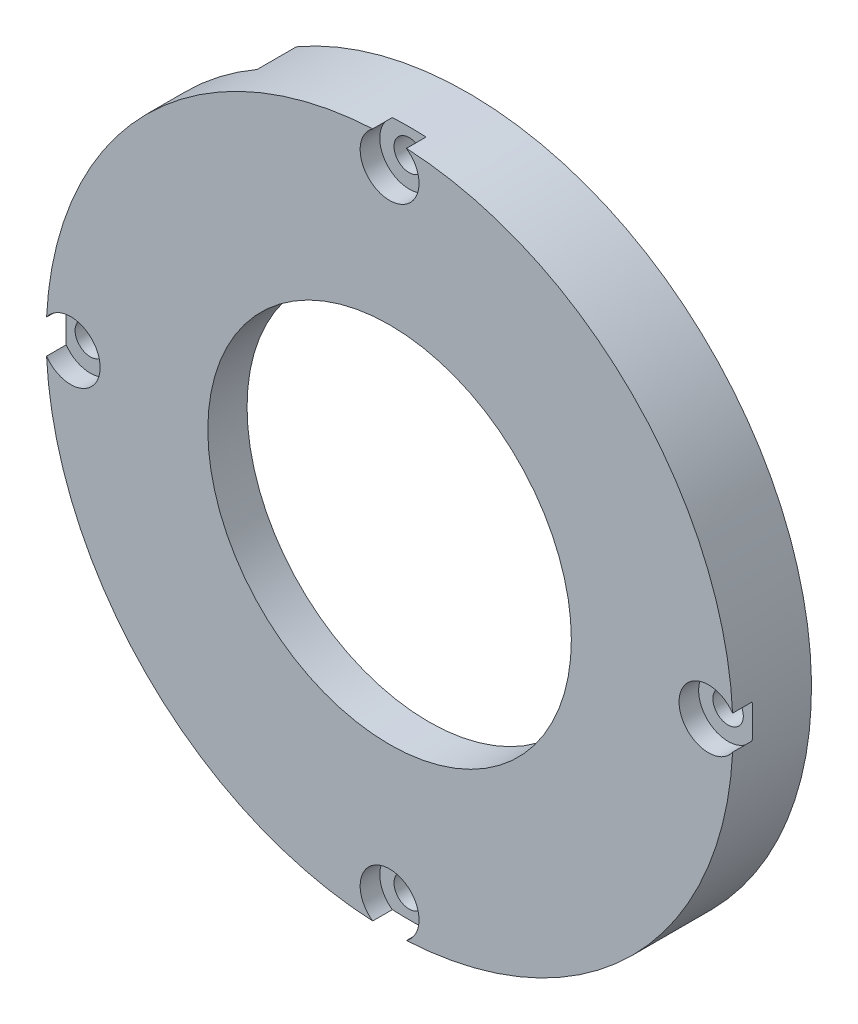
ISO-10303-21;
HEADER;
FILE_DESCRIPTION(('STEP AP214'),'2;1');
FILE_NAME('part.step','',(''),(''),'','','');
FILE_SCHEMA(('AUTOMOTIVE_DESIGN { 1 0 10303 214 1 1 1 1 }'));
ENDSEC;
DATA;
#1=APPLICATION_CONTEXT('core data for automotive mechanical design processes');
#2=APPLICATION_PROTOCOL_DEFINITION('international standard','automotive_design',2000,#1);
#3=PRODUCT_CONTEXT('',#1,'mechanical');
#4=PRODUCT('Part','Part','',(#3));
#5=PRODUCT_RELATED_PRODUCT_CATEGORY('part','',(#4));
#6=PRODUCT_DEFINITION_FORMATION('','',#4);
#7=PRODUCT_DEFINITION_CONTEXT('part definition',#1,'design');
#8=PRODUCT_DEFINITION('design','',#6,#7);
#9=PRODUCT_DEFINITION_SHAPE('','',#8);
#10=(LENGTH_UNIT() NAMED_UNIT(*) SI_UNIT(.MILLI.,.METRE.));
#11=(NAMED_UNIT(*) PLANE_ANGLE_UNIT() SI_UNIT($,.RADIAN.));
#12=(NAMED_UNIT(*) SI_UNIT($,.STERADIAN.) SOLID_ANGLE_UNIT());
#13=UNCERTAINTY_MEASURE_WITH_UNIT(LENGTH_MEASURE(1.E-05),#10,'distance_accuracy_value','');
#14=(GEOMETRIC_REPRESENTATION_CONTEXT(3) GLOBAL_UNCERTAINTY_ASSIGNED_CONTEXT((#13)) GLOBAL_UNIT_ASSIGNED_CONTEXT((#10,
#11,#12)) REPRESENTATION_CONTEXT('',''));
#15=CARTESIAN_POINT('',(0.,0.,0.));
#16=DIRECTION('',(0.,0.,1.));
#17=DIRECTION('',(1.,0.,0.));
#18=AXIS2_PLACEMENT_3D('',#15,#16,#17);
#19=CARTESIAN_POINT('',(0.,32.5,10.));
#20=DIRECTION('',(0.,0.,-1.));
#21=DIRECTION('',(-1.,0.,0.));
#22=AXIS2_PLACEMENT_3D('',#19,#20,#21);
#23=CYLINDRICAL_SURFACE('',#22,1.55);
#24=CARTESIAN_POINT('',(0.,32.5,2.));
#25=DIRECTION('',(0.,0.,-1.));
#26=DIRECTION('',(-1.,0.,0.));
#27=AXIS2_PLACEMENT_3D('',#24,#25,#26);
#28=CIRCLE('',#27,1.55);
#29=CARTESIAN_POINT('',(-1.55,32.5,2.));
#30=VERTEX_POINT('',#29);
#31=EDGE_CURVE('E184',#30,#30,#28,.T.);
#32=ORIENTED_EDGE('',*,*,#31,.T.);
#33=EDGE_LOOP('',(#32));
#34=FACE_BOUND('',#33,.T.);
#35=CARTESIAN_POINT('',(0.,32.5,8.));
#36=DIRECTION('',(0.,0.,1.));
#37=DIRECTION('',(1.,0.,0.));
#38=AXIS2_PLACEMENT_3D('',#35,#36,#37);
#39=CIRCLE('',#38,1.55);
#40=CARTESIAN_POINT('',(1.55,32.5,8.));
#41=VERTEX_POINT('',#40);
#42=EDGE_CURVE('E46',#41,#41,#39,.T.);
#43=ORIENTED_EDGE('',*,*,#42,.T.);
#44=EDGE_LOOP('',(#43));
#45=FACE_BOUND('',#44,.T.);
#46=ADVANCED_FACE('F42',(#34,#45),#23,.F.);
#47=CARTESIAN_POINT('',(32.5000000000009,9.17735403342287E-13,10.));
#48=DIRECTION('',(0.,0.,-1.));
#49=DIRECTION('',(-1.,0.,0.));
#50=AXIS2_PLACEMENT_3D('',#47,#48,#49);
#51=CYLINDRICAL_SURFACE('',#50,1.55000000000072);
#52=CARTESIAN_POINT('',(32.5000000000009,9.17735403342287E-13,2.));
#53=DIRECTION('',(0.,0.,-1.));
#54=DIRECTION('',(-1.,0.,0.));
#55=AXIS2_PLACEMENT_3D('',#52,#53,#54);
#56=CIRCLE('',#55,1.55000000000072);
#57=CARTESIAN_POINT('',(30.9500000000002,9.17735403342287E-13,2.));
#58=VERTEX_POINT('',#57);
#59=EDGE_CURVE('E181',#58,#58,#56,.T.);
#60=ORIENTED_EDGE('',*,*,#59,.T.);
#61=EDGE_LOOP('',(#60));
#62=FACE_BOUND('',#61,.T.);
#63=CARTESIAN_POINT('',(32.5000000000009,9.17735403342287E-13,8.));
#64=DIRECTION('',(0.,0.,1.));
#65=DIRECTION('',(1.,0.,0.));
#66=AXIS2_PLACEMENT_3D('',#63,#64,#65);
#67=CIRCLE('',#66,1.55000000000072);
#68=CARTESIAN_POINT('',(34.0500000000016,9.17735403342287E-13,8.));
#69=VERTEX_POINT('',#68);
#70=EDGE_CURVE('E163',#69,#69,#67,.T.);
#71=ORIENTED_EDGE('',*,*,#70,.T.);
#72=EDGE_LOOP('',(#71));
#73=FACE_BOUND('',#72,.T.);
#74=ADVANCED_FACE('F226',(#62,#73),#51,.F.);
#75=CARTESIAN_POINT('',(1.83547080668457E-12,-32.5,10.));
#76=DIRECTION('',(0.,0.,-1.));
#77=DIRECTION('',(-1.,0.,0.));
#78=AXIS2_PLACEMENT_3D('',#75,#76,#77);
#79=CYLINDRICAL_SURFACE('',#78,1.55000000000197);
#80=CARTESIAN_POINT('',(1.83547080668457E-12,-32.5,2.));
#81=DIRECTION('',(0.,0.,-1.));
#82=DIRECTION('',(-1.,0.,0.));
#83=AXIS2_PLACEMENT_3D('',#80,#81,#82);
#84=CIRCLE('',#83,1.55000000000197);
#85=CARTESIAN_POINT('',(-1.55000000000014,-32.5,2.));
#86=VERTEX_POINT('',#85);
#87=EDGE_CURVE('E178',#86,#86,#84,.T.);
#88=ORIENTED_EDGE('',*,*,#87,.T.);
#89=EDGE_LOOP('',(#88));
#90=FACE_BOUND('',#89,.T.);
#91=CARTESIAN_POINT('',(1.83547080668457E-12,-32.5,8.));
#92=DIRECTION('',(0.,0.,1.));
#93=DIRECTION('',(1.,0.,0.));
#94=AXIS2_PLACEMENT_3D('',#91,#92,#93);
#95=CIRCLE('',#94,1.55000000000197);
#96=CARTESIAN_POINT('',(1.55000000000381,-32.5,8.));
#97=VERTEX_POINT('',#96);
#98=EDGE_CURVE('E150',#97,#97,#95,.T.);
#99=ORIENTED_EDGE('',*,*,#98,.T.);
#100=EDGE_LOOP('',(#99));
#101=FACE_BOUND('',#100,.T.);
#102=ADVANCED_FACE('F293',(#90,#101),#79,.F.);
#103=CARTESIAN_POINT('',(-32.4999999999991,-9.21715505439516E-13,10.));
#104=DIRECTION('',(0.,0.,-1.));
#105=DIRECTION('',(-1.,0.,0.));
#106=AXIS2_PLACEMENT_3D('',#103,#104,#105);
#107=CYLINDRICAL_SURFACE('',#106,1.55000000000148);
#108=CARTESIAN_POINT('',(-32.4999999999991,-9.21715505439516E-13,2.));
#109=DIRECTION('',(0.,0.,-1.));
#110=DIRECTION('',(-1.,0.,0.));
#111=AXIS2_PLACEMENT_3D('',#108,#109,#110);
#112=CIRCLE('',#111,1.55000000000148);
#113=CARTESIAN_POINT('',(-34.0500000000006,-9.21715505439516E-13,2.));
#114=VERTEX_POINT('',#113);
#115=EDGE_CURVE('E175',#114,#114,#112,.T.);
#116=ORIENTED_EDGE('',*,*,#115,.T.);
#117=EDGE_LOOP('',(#116));
#118=FACE_BOUND('',#117,.T.);
#119=CARTESIAN_POINT('',(-32.4999999999991,-9.21715505439516E-13,8.));
#120=DIRECTION('',(0.,0.,1.));
#121=DIRECTION('',(1.,0.,0.));
#122=AXIS2_PLACEMENT_3D('',#119,#120,#121);
#123=CIRCLE('',#122,1.55000000000148);
#124=CARTESIAN_POINT('',(-30.9499999999976,-9.21715505439516E-13,8.));
#125=VERTEX_POINT('',#124);
#126=EDGE_CURVE('E151',#125,#125,#123,.T.);
#127=ORIENTED_EDGE('',*,*,#126,.T.);
#128=EDGE_LOOP('',(#127));
#129=FACE_BOUND('',#128,.T.);
#130=ADVANCED_FACE('F301',(#118,#129),#107,.F.);
#131=CARTESIAN_POINT('',(0.,0.,10.));
#132=DIRECTION('',(0.,0.,-1.));
#133=DIRECTION('',(-1.,0.,0.));
#134=AXIS2_PLACEMENT_3D('',#131,#132,#133);
#135=CYLINDRICAL_SURFACE('',#134,30.05);
#136=DIRECTION('',(0.,0.,-1.));
#137=VECTOR('',#136,1.);
#138=CARTESIAN_POINT('',(-15.025,26.0240633837224,6.));
#139=LINE('',#138,#137);
#140=CARTESIAN_POINT('',(-15.025,26.0240633837224,6.));
#141=VERTEX_POINT('',#140);
#142=CARTESIAN_POINT('',(-15.025,26.0240633837224,2.));
#143=VERTEX_POINT('',#142);
#144=EDGE_CURVE('E195',#141,#143,#139,.T.);
#145=ORIENTED_EDGE('',*,*,#144,.T.);
#146=CARTESIAN_POINT('',(0.,0.,2.));
#147=DIRECTION('',(0.,0.,-1.));
#148=DIRECTION('',(-1.,0.,0.));
#149=AXIS2_PLACEMENT_3D('',#146,#147,#148);
#150=CIRCLE('',#149,30.05);
#151=CARTESIAN_POINT('',(-26.0240633837224,15.0249999999999,2.));
#152=VERTEX_POINT('',#151);
#153=EDGE_CURVE('E168',#143,#152,#150,.T.);
#154=ORIENTED_EDGE('',*,*,#153,.T.);
#155=DIRECTION('',(0.,0.,-1.));
#156=VECTOR('',#155,1.);
#157=CARTESIAN_POINT('',(-26.0240633837224,15.0249999999999,6.));
#158=LINE('',#157,#156);
#159=CARTESIAN_POINT('',(-26.0240633837224,15.0249999999999,6.));
#160=VERTEX_POINT('',#159);
#161=EDGE_CURVE('E194',#160,#152,#158,.T.);
#162=ORIENTED_EDGE('',*,*,#161,.F.);
#163=CARTESIAN_POINT('',(0.,0.,6.));
#164=DIRECTION('',(0.,0.,1.));
#165=DIRECTION('',(1.,0.,0.));
#166=AXIS2_PLACEMENT_3D('',#163,#164,#165);
#167=CIRCLE('',#166,30.05);
#168=EDGE_CURVE('E210',#160,#141,#167,.T.);
#169=ORIENTED_EDGE('',*,*,#168,.T.);
#170=EDGE_LOOP('',(#145,#154,#162,#169));
#171=FACE_BOUND('',#170,.T.);
#172=ADVANCED_FACE('F299',(#171),#135,.F.);
#173=CARTESIAN_POINT('',(0.,0.,10.));
#174=DIRECTION('',(0.,0.,-1.));
#175=DIRECTION('',(-1.,0.,0.));
#176=AXIS2_PLACEMENT_3D('',#173,#174,#175);
#177=CYLINDRICAL_SURFACE('',#176,35.);
#178=CARTESIAN_POINT('',(0.,0.,8.));
#179=DIRECTION('',(0.,0.,1.));
#180=DIRECTION('',(1.,0.,0.));
#181=AXIS2_PLACEMENT_3D('',#178,#179,#180);
#182=CIRCLE('',#181,35.);
#183=CARTESIAN_POINT('',(1.72039196717202,34.9576923076923,8.));
#184=VERTEX_POINT('',#183);
#185=CARTESIAN_POINT('',(-1.72039196717202,34.9576923076923,8.));
#186=VERTEX_POINT('',#185);
#187=EDGE_CURVE('E166',#184,#186,#182,.T.);
#188=ORIENTED_EDGE('',*,*,#187,.F.);
#189=DIRECTION('',(0.,0.,1.));
#190=VECTOR('',#189,1.);
#191=CARTESIAN_POINT('',(1.72039196717204,34.9576923076923,9.));
#192=LINE('',#191,#190);
#193=CARTESIAN_POINT('',(1.72039196717204,34.9576923076923,10.));
#194=VERTEX_POINT('',#193);
#195=EDGE_CURVE('E157',#184,#194,#192,.T.);
#196=ORIENTED_EDGE('',*,*,#195,.T.);
#197=CARTESIAN_POINT('',(0.,0.,10.));
#198=DIRECTION('',(0.,0.,1.));
#199=DIRECTION('',(1.,0.,0.));
#200=AXIS2_PLACEMENT_3D('',#197,#198,#199);
#201=CIRCLE('',#200,35.);
#202=CARTESIAN_POINT('',(34.9576923076921,1.72039196717575,10.));
#203=VERTEX_POINT('',#202);
#204=EDGE_CURVE('E216',#203,#194,#201,.T.);
#205=ORIENTED_EDGE('',*,*,#204,.F.);
#206=DIRECTION('',(0.,0.,1.));
#207=VECTOR('',#206,1.);
#208=CARTESIAN_POINT('',(34.9576923076921,1.72039196717575,9.));
#209=LINE('',#208,#207);
#210=CARTESIAN_POINT('',(34.9576923076921,1.72039196717577,8.));
#211=VERTEX_POINT('',#210);
#212=EDGE_CURVE('E241',#203,#211,#209,.F.);
#213=ORIENTED_EDGE('',*,*,#212,.T.);
#214=CARTESIAN_POINT('',(0.,0.,8.));
#215=DIRECTION('',(0.,0.,1.));
#216=DIRECTION('',(1.,0.,0.));
#217=AXIS2_PLACEMENT_3D('',#214,#215,#216);
#218=CIRCLE('',#217,35.);
#219=CARTESIAN_POINT('',(34.9576923076922,-1.72039196717379,8.));
#220=VERTEX_POINT('',#219);
#221=EDGE_CURVE('E164',#220,#211,#218,.T.);
#222=ORIENTED_EDGE('',*,*,#221,.F.);
#223=DIRECTION('',(0.,0.,1.));
#224=VECTOR('',#223,1.);
#225=CARTESIAN_POINT('',(34.9576923076922,-1.72039196717378,9.));
#226=LINE('',#225,#224);
#227=CARTESIAN_POINT('',(34.9576923076922,-1.72039196717378,10.));
#228=VERTEX_POINT('',#227);
#229=EDGE_CURVE('E243',#220,#228,#226,.T.);
#230=ORIENTED_EDGE('',*,*,#229,.T.);
#231=CARTESIAN_POINT('',(1.72039196717768,-34.957692307692,10.));
#232=VERTEX_POINT('',#231);
#233=EDGE_CURVE('E215',#232,#228,#201,.T.);
#234=ORIENTED_EDGE('',*,*,#233,.F.);
#235=DIRECTION('',(0.,0.,1.));
#236=VECTOR('',#235,1.);
#237=CARTESIAN_POINT('',(1.72039196717768,-34.957692307692,9.));
#238=LINE('',#237,#236);
#239=CARTESIAN_POINT('',(1.7203919671777,-34.957692307692,8.));
#240=VERTEX_POINT('',#239);
#241=EDGE_CURVE('E59',#232,#240,#238,.F.);
#242=ORIENTED_EDGE('',*,*,#241,.T.);
#243=CARTESIAN_POINT('',(0.,0.,8.));
#244=DIRECTION('',(0.,0.,1.));
#245=DIRECTION('',(1.,0.,0.));
#246=AXIS2_PLACEMENT_3D('',#243,#244,#245);
#247=CIRCLE('',#246,35.);
#248=CARTESIAN_POINT('',(-1.72039196717375,-34.9576923076922,8.));
#249=VERTEX_POINT('',#248);
#250=EDGE_CURVE('E154',#249,#240,#247,.T.);
#251=ORIENTED_EDGE('',*,*,#250,.F.);
#252=DIRECTION('',(0.,0.,1.));
#253=VECTOR('',#252,1.);
#254=CARTESIAN_POINT('',(-1.72039196717374,-34.9576923076922,9.));
#255=LINE('',#254,#253);
#256=CARTESIAN_POINT('',(-1.72039196717374,-34.9576923076922,10.));
#257=VERTEX_POINT('',#256);
#258=EDGE_CURVE('E249',#249,#257,#255,.T.);
#259=ORIENTED_EDGE('',*,*,#258,.T.);
#260=CARTESIAN_POINT('',(-34.9576923076922,-1.7203919671743,10.));
#261=VERTEX_POINT('',#260);
#262=EDGE_CURVE('E272',#261,#257,#201,.T.);
#263=ORIENTED_EDGE('',*,*,#262,.F.);
#264=DIRECTION('',(0.,0.,1.));
#265=VECTOR('',#264,1.);
#266=CARTESIAN_POINT('',(-34.9576923076922,-1.72039196717432,9.));
#267=LINE('',#266,#265);
#268=CARTESIAN_POINT('',(-34.9576923076922,-1.72039196717437,8.));
#269=VERTEX_POINT('',#268);
#270=EDGE_CURVE('E67',#261,#269,#267,.F.);
#271=ORIENTED_EDGE('',*,*,#270,.T.);
#272=CARTESIAN_POINT('',(0.,0.,8.));
#273=DIRECTION('',(0.,0.,1.));
#274=DIRECTION('',(1.,0.,0.));
#275=AXIS2_PLACEMENT_3D('',#272,#273,#274);
#276=CIRCLE('',#275,35.);
#277=CARTESIAN_POINT('',(-34.9576923076923,1.72039196717239,8.));
#278=VERTEX_POINT('',#277);
#279=EDGE_CURVE('E144',#278,#269,#276,.T.);
#280=ORIENTED_EDGE('',*,*,#279,.F.);
#281=DIRECTION('',(0.,0.,1.));
#282=VECTOR('',#281,1.);
#283=CARTESIAN_POINT('',(-34.9576923076923,1.72039196717234,9.));
#284=LINE('',#283,#282);
#285=CARTESIAN_POINT('',(-34.9576923076923,1.72039196717234,10.));
#286=VERTEX_POINT('',#285);
#287=EDGE_CURVE('E132',#278,#286,#284,.T.);
#288=ORIENTED_EDGE('',*,*,#287,.T.);
#289=CARTESIAN_POINT('',(-1.72039196717205,34.9576923076923,10.));
#290=VERTEX_POINT('',#289);
#291=EDGE_CURVE('E220',#290,#286,#201,.T.);
#292=ORIENTED_EDGE('',*,*,#291,.F.);
#293=DIRECTION('',(0.,0.,1.));
#294=VECTOR('',#293,1.);
#295=CARTESIAN_POINT('',(-1.72039196717204,34.9576923076923,9.));
#296=LINE('',#295,#294);
#297=EDGE_CURVE('E251',#290,#186,#296,.F.);
#298=ORIENTED_EDGE('',*,*,#297,.T.);
#299=EDGE_LOOP('',(#188,#196,#205,#213,#222,#230,#234,#242,#251,#259,#263,#271,#280,#288,#292,#298));
#300=FACE_BOUND('',#299,.T.);
#301=CARTESIAN_POINT('',(0.,0.,2.));
#302=DIRECTION('',(0.,0.,-1.));
#303=DIRECTION('',(-1.,0.,0.));
#304=AXIS2_PLACEMENT_3D('',#301,#302,#303);
#305=CIRCLE('',#304,35.);
#306=CARTESIAN_POINT('',(-17.5,30.3108891324554,2.));
#307=VERTEX_POINT('',#306);
#308=CARTESIAN_POINT('',(-30.3108891324554,17.4999999999999,2.));
#309=VERTEX_POINT('',#308);
#310=EDGE_CURVE('E171',#307,#309,#305,.T.);
#311=ORIENTED_EDGE('',*,*,#310,.F.);
#312=DIRECTION('',(0.,0.,-1.));
#313=VECTOR('',#312,1.);
#314=CARTESIAN_POINT('',(-17.5,30.3108891324553,6.));
#315=LINE('',#314,#313);
#316=CARTESIAN_POINT('',(-17.5,30.3108891324553,6.));
#317=VERTEX_POINT('',#316);
#318=EDGE_CURVE('E199',#317,#307,#315,.T.);
#319=ORIENTED_EDGE('',*,*,#318,.F.);
#320=CARTESIAN_POINT('',(0.,0.,6.));
#321=DIRECTION('',(0.,0.,-1.));
#322=DIRECTION('',(-1.,0.,0.));
#323=AXIS2_PLACEMENT_3D('',#320,#321,#322);
#324=CIRCLE('',#323,35.);
#325=CARTESIAN_POINT('',(-30.3108891324554,17.4999999999999,6.));
#326=VERTEX_POINT('',#325);
#327=EDGE_CURVE('E190',#326,#317,#324,.T.);
#328=ORIENTED_EDGE('',*,*,#327,.F.);
#329=DIRECTION('',(0.,0.,-1.));
#330=VECTOR('',#329,1.);
#331=CARTESIAN_POINT('',(-30.3108891324554,17.4999999999999,6.));
#332=LINE('',#331,#330);
#333=EDGE_CURVE('E202',#326,#309,#332,.T.);
#334=ORIENTED_EDGE('',*,*,#333,.T.);
#335=EDGE_LOOP('',(#311,#319,#328,#334));
#336=FACE_BOUND('',#335,.T.);
#337=ADVANCED_FACE('F44',(#300,#336),#177,.T.);
#338=CARTESIAN_POINT('',(-15.025,26.0240633837224,6.));
#339=DIRECTION('',(0.866025403784438,0.500000000000001,0.));
#340=DIRECTION('',(-0.500000000000001,0.866025403784438,0.));
#341=AXIS2_PLACEMENT_3D('',#338,#339,#340);
#342=PLANE('',#341);
#343=DIRECTION('',(-0.500000000000001,0.866025403784438,0.));
#344=VECTOR('',#343,1.);
#345=CARTESIAN_POINT('',(-15.025,26.0240633837224,2.));
#346=LINE('',#345,#344);
#347=EDGE_CURVE('E173',#143,#307,#346,.T.);
#348=ORIENTED_EDGE('',*,*,#347,.F.);
#349=ORIENTED_EDGE('',*,*,#144,.F.);
#350=DIRECTION('',(0.500000000000001,-0.866025403784438,0.));
#351=VECTOR('',#350,1.);
#352=CARTESIAN_POINT('',(-15.025,26.0240633837224,6.));
#353=LINE('',#352,#351);
#354=EDGE_CURVE('E192',#317,#141,#353,.T.);
#355=ORIENTED_EDGE('',*,*,#354,.F.);
#356=ORIENTED_EDGE('',*,*,#318,.T.);
#357=EDGE_LOOP('',(#348,#349,#355,#356));
#358=FACE_BOUND('',#357,.T.);
#359=ADVANCED_FACE('F313',(#358),#342,.F.);
#360=CARTESIAN_POINT('',(-26.0240633837224,15.0249999999999,6.));
#361=DIRECTION('',(-0.499999999999998,-0.86602540378444,0.));
#362=DIRECTION('',(0.86602540378444,-0.499999999999998,0.));
#363=AXIS2_PLACEMENT_3D('',#360,#361,#362);
#364=PLANE('',#363);
#365=DIRECTION('',(0.86602540378444,-0.499999999999998,0.));
#366=VECTOR('',#365,1.);
#367=CARTESIAN_POINT('',(-26.0240633837224,15.0249999999999,2.));
#368=LINE('',#367,#366);
#369=EDGE_CURVE('E219',#309,#152,#368,.T.);
#370=ORIENTED_EDGE('',*,*,#369,.F.);
#371=ORIENTED_EDGE('',*,*,#333,.F.);
#372=DIRECTION('',(-0.86602540378444,0.499999999999998,0.));
#373=VECTOR('',#372,1.);
#374=CARTESIAN_POINT('',(-26.0240633837224,15.0249999999999,6.));
#375=LINE('',#374,#373);
#376=EDGE_CURVE('E187',#160,#326,#375,.T.);
#377=ORIENTED_EDGE('',*,*,#376,.F.);
#378=ORIENTED_EDGE('',*,*,#161,.T.);
#379=EDGE_LOOP('',(#370,#371,#377,#378));
#380=FACE_BOUND('',#379,.T.);
#381=ADVANCED_FACE('F305',(#380),#364,.F.);
#382=CARTESIAN_POINT('',(0.,0.,10.));
#383=DIRECTION('',(0.,0.,1.));
#384=DIRECTION('',(1.,0.,0.));
#385=AXIS2_PLACEMENT_3D('',#382,#383,#384);
#386=PLANE('',#385);
#387=CARTESIAN_POINT('',(0.,32.5,10.));
#388=DIRECTION('',(0.,0.,1.));
#389=DIRECTION('',(1.,0.,0.));
#390=AXIS2_PLACEMENT_3D('',#387,#388,#389);
#391=CIRCLE('',#390,3.);
#392=EDGE_CURVE('E12',#290,#194,#391,.T.);
#393=ORIENTED_EDGE('',*,*,#392,.F.);
#394=ORIENTED_EDGE('',*,*,#291,.T.);
#395=CARTESIAN_POINT('',(-32.4999999999991,-9.21715505439516E-13,10.));
#396=DIRECTION('',(0.,0.,1.));
#397=DIRECTION('',(1.,0.,0.));
#398=AXIS2_PLACEMENT_3D('',#395,#396,#397);
#399=CIRCLE('',#398,3.00000000000148);
#400=EDGE_CURVE('E136',#261,#286,#399,.T.);
#401=ORIENTED_EDGE('',*,*,#400,.F.);
#402=ORIENTED_EDGE('',*,*,#262,.T.);
#403=CARTESIAN_POINT('',(1.83547080668457E-12,-32.5,10.));
#404=DIRECTION('',(0.,0.,1.));
#405=DIRECTION('',(1.,0.,0.));
#406=AXIS2_PLACEMENT_3D('',#403,#404,#405);
#407=CIRCLE('',#406,3.00000000000197);
#408=EDGE_CURVE('E51',#232,#257,#407,.T.);
#409=ORIENTED_EDGE('',*,*,#408,.F.);
#410=ORIENTED_EDGE('',*,*,#233,.T.);
#411=CARTESIAN_POINT('',(32.5000000000009,9.17735403342287E-13,10.));
#412=DIRECTION('',(0.,0.,1.));
#413=DIRECTION('',(1.,0.,0.));
#414=AXIS2_PLACEMENT_3D('',#411,#412,#413);
#415=CIRCLE('',#414,3.00000000000072);
#416=EDGE_CURVE('E245',#203,#228,#415,.T.);
#417=ORIENTED_EDGE('',*,*,#416,.F.);
#418=ORIENTED_EDGE('',*,*,#204,.T.);
#419=EDGE_LOOP('',(#393,#394,#401,#402,#409,#410,#417,#418));
#420=FACE_BOUND('',#419,.T.);
#421=CARTESIAN_POINT('',(0.,0.,10.));
#422=DIRECTION('',(0.,0.,1.));
#423=DIRECTION('',(1.,0.,0.));
#424=AXIS2_PLACEMENT_3D('',#421,#422,#423);
#425=CIRCLE('',#424,18.525);
#426=CARTESIAN_POINT('',(18.525,0.,10.));
#427=VERTEX_POINT('',#426);
#428=EDGE_CURVE('E198',#427,#427,#425,.T.);
#429=ORIENTED_EDGE('',*,*,#428,.F.);
#430=EDGE_LOOP('',(#429));
#431=FACE_BOUND('',#430,.T.);
#432=ADVANCED_FACE('F262',(#420,#431),#386,.T.);
#433=CARTESIAN_POINT('',(0.,0.,6.));
#434=DIRECTION('',(0.,0.,1.));
#435=DIRECTION('',(1.,0.,0.));
#436=AXIS2_PLACEMENT_3D('',#433,#434,#435);
#437=PLANE('',#436);
#438=CARTESIAN_POINT('',(0.,0.,6.));
#439=DIRECTION('',(0.,0.,1.));
#440=DIRECTION('',(1.,0.,0.));
#441=AXIS2_PLACEMENT_3D('',#438,#439,#440);
#442=CIRCLE('',#441,18.525);
#443=CARTESIAN_POINT('',(18.525,0.,6.));
#444=VERTEX_POINT('',#443);
#445=EDGE_CURVE('E207',#444,#444,#442,.T.);
#446=ORIENTED_EDGE('',*,*,#445,.T.);
#447=EDGE_LOOP('',(#446));
#448=FACE_BOUND('',#447,.T.);
#449=ORIENTED_EDGE('',*,*,#168,.F.);
#450=ORIENTED_EDGE('',*,*,#376,.T.);
#451=ORIENTED_EDGE('',*,*,#327,.T.);
#452=ORIENTED_EDGE('',*,*,#354,.T.);
#453=EDGE_LOOP('',(#449,#450,#451,#452));
#454=FACE_BOUND('',#453,.T.);
#455=ADVANCED_FACE('F304',(#448,#454),#437,.F.);
#456=CARTESIAN_POINT('',(0.,0.,6.));
#457=DIRECTION('',(0.,0.,1.));
#458=DIRECTION('',(1.,0.,0.));
#459=AXIS2_PLACEMENT_3D('',#456,#457,#458);
#460=CYLINDRICAL_SURFACE('',#459,18.525);
#461=ORIENTED_EDGE('',*,*,#445,.F.);
#462=EDGE_LOOP('',(#461));
#463=FACE_BOUND('',#462,.T.);
#464=ORIENTED_EDGE('',*,*,#428,.T.);
#465=EDGE_LOOP('',(#464));
#466=FACE_BOUND('',#465,.T.);
#467=ADVANCED_FACE('F310',(#463,#466),#460,.F.);
#468=CARTESIAN_POINT('',(0.,0.,2.));
#469=DIRECTION('',(0.,0.,-1.));
#470=DIRECTION('',(-1.,0.,0.));
#471=AXIS2_PLACEMENT_3D('',#468,#469,#470);
#472=PLANE('',#471);
#473=ORIENTED_EDGE('',*,*,#31,.F.);
#474=EDGE_LOOP('',(#473));
#475=FACE_BOUND('',#474,.T.);
#476=ORIENTED_EDGE('',*,*,#59,.F.);
#477=EDGE_LOOP('',(#476));
#478=FACE_BOUND('',#477,.T.);
#479=ORIENTED_EDGE('',*,*,#87,.F.);
#480=EDGE_LOOP('',(#479));
#481=FACE_BOUND('',#480,.T.);
#482=ORIENTED_EDGE('',*,*,#115,.F.);
#483=EDGE_LOOP('',(#482));
#484=FACE_BOUND('',#483,.T.);
#485=ORIENTED_EDGE('',*,*,#347,.T.);
#486=ORIENTED_EDGE('',*,*,#310,.T.);
#487=ORIENTED_EDGE('',*,*,#369,.T.);
#488=ORIENTED_EDGE('',*,*,#153,.F.);
#489=EDGE_LOOP('',(#485,#486,#487,#488));
#490=FACE_BOUND('',#489,.T.);
#491=ADVANCED_FACE('F325',(#475,#478,#481,#484,#490),#472,.T.);
#492=CARTESIAN_POINT('',(-32.4999999999991,-9.21715505439516E-13,8.));
#493=DIRECTION('',(0.,0.,1.));
#494=DIRECTION('',(1.,0.,0.));
#495=AXIS2_PLACEMENT_3D('',#492,#493,#494);
#496=PLANE('',#495);
#497=ORIENTED_EDGE('',*,*,#126,.F.);
#498=EDGE_LOOP('',(#497));
#499=FACE_BOUND('',#498,.T.);
#500=ORIENTED_EDGE('',*,*,#279,.T.);
#501=CARTESIAN_POINT('',(-32.4999999999991,-9.21715505439516E-13,8.));
#502=DIRECTION('',(0.,0.,1.));
#503=DIRECTION('',(1.,0.,0.));
#504=AXIS2_PLACEMENT_3D('',#501,#502,#503);
#505=CIRCLE('',#504,3.00000000000148);
#506=EDGE_CURVE('E135',#269,#278,#505,.T.);
#507=ORIENTED_EDGE('',*,*,#506,.T.);
#508=EDGE_LOOP('',(#500,#507));
#509=FACE_BOUND('',#508,.T.);
#510=ADVANCED_FACE('F143',(#499,#509),#496,.T.);
#511=CARTESIAN_POINT('',(-32.4999999999991,-9.21715505439516E-13,8.));
#512=DIRECTION('',(0.,0.,1.));
#513=DIRECTION('',(1.,0.,0.));
#514=AXIS2_PLACEMENT_3D('',#511,#512,#513);
#515=CYLINDRICAL_SURFACE('',#514,3.00000000000148);
#516=ORIENTED_EDGE('',*,*,#506,.F.);
#517=ORIENTED_EDGE('',*,*,#270,.F.);
#518=ORIENTED_EDGE('',*,*,#400,.T.);
#519=ORIENTED_EDGE('',*,*,#287,.F.);
#520=EDGE_LOOP('',(#516,#517,#518,#519));
#521=FACE_BOUND('',#520,.T.);
#522=ADVANCED_FACE('F134',(#521),#515,.F.);
#523=CARTESIAN_POINT('',(1.83547080668457E-12,-32.5,8.));
#524=DIRECTION('',(0.,0.,1.));
#525=DIRECTION('',(1.,0.,0.));
#526=AXIS2_PLACEMENT_3D('',#523,#524,#525);
#527=PLANE('',#526);
#528=ORIENTED_EDGE('',*,*,#98,.F.);
#529=EDGE_LOOP('',(#528));
#530=FACE_BOUND('',#529,.T.);
#531=ORIENTED_EDGE('',*,*,#250,.T.);
#532=CARTESIAN_POINT('',(1.83547080668457E-12,-32.5,8.));
#533=DIRECTION('',(0.,0.,1.));
#534=DIRECTION('',(1.,0.,0.));
#535=AXIS2_PLACEMENT_3D('',#532,#533,#534);
#536=CIRCLE('',#535,3.00000000000197);
#537=EDGE_CURVE('E145',#240,#249,#536,.T.);
#538=ORIENTED_EDGE('',*,*,#537,.T.);
#539=EDGE_LOOP('',(#531,#538));
#540=FACE_BOUND('',#539,.T.);
#541=ADVANCED_FACE('F275',(#530,#540),#527,.T.);
#542=CARTESIAN_POINT('',(1.83547080668457E-12,-32.5,8.));
#543=DIRECTION('',(0.,0.,1.));
#544=DIRECTION('',(1.,0.,0.));
#545=AXIS2_PLACEMENT_3D('',#542,#543,#544);
#546=CYLINDRICAL_SURFACE('',#545,3.00000000000197);
#547=ORIENTED_EDGE('',*,*,#537,.F.);
#548=ORIENTED_EDGE('',*,*,#241,.F.);
#549=ORIENTED_EDGE('',*,*,#408,.T.);
#550=ORIENTED_EDGE('',*,*,#258,.F.);
#551=EDGE_LOOP('',(#547,#548,#549,#550));
#552=FACE_BOUND('',#551,.T.);
#553=ADVANCED_FACE('F232',(#552),#546,.F.);
#554=CARTESIAN_POINT('',(32.5000000000009,9.17735403342287E-13,8.));
#555=DIRECTION('',(0.,0.,1.));
#556=DIRECTION('',(1.,0.,0.));
#557=AXIS2_PLACEMENT_3D('',#554,#555,#556);
#558=PLANE('',#557);
#559=ORIENTED_EDGE('',*,*,#70,.F.);
#560=EDGE_LOOP('',(#559));
#561=FACE_BOUND('',#560,.T.);
#562=ORIENTED_EDGE('',*,*,#221,.T.);
#563=CARTESIAN_POINT('',(32.5000000000009,9.17735403342287E-13,8.));
#564=DIRECTION('',(0.,0.,1.));
#565=DIRECTION('',(1.,0.,0.));
#566=AXIS2_PLACEMENT_3D('',#563,#564,#565);
#567=CIRCLE('',#566,3.00000000000072);
#568=EDGE_CURVE('E237',#211,#220,#567,.T.);
#569=ORIENTED_EDGE('',*,*,#568,.T.);
#570=EDGE_LOOP('',(#562,#569));
#571=FACE_BOUND('',#570,.T.);
#572=ADVANCED_FACE('F228',(#561,#571),#558,.T.);
#573=CARTESIAN_POINT('',(32.5000000000009,9.17735403342287E-13,8.));
#574=DIRECTION('',(0.,0.,1.));
#575=DIRECTION('',(1.,0.,0.));
#576=AXIS2_PLACEMENT_3D('',#573,#574,#575);
#577=CYLINDRICAL_SURFACE('',#576,3.00000000000072);
#578=ORIENTED_EDGE('',*,*,#568,.F.);
#579=ORIENTED_EDGE('',*,*,#212,.F.);
#580=ORIENTED_EDGE('',*,*,#416,.T.);
#581=ORIENTED_EDGE('',*,*,#229,.F.);
#582=EDGE_LOOP('',(#578,#579,#580,#581));
#583=FACE_BOUND('',#582,.T.);
#584=ADVANCED_FACE('F231',(#583),#577,.F.);
#585=CARTESIAN_POINT('',(0.,32.5,8.));
#586=DIRECTION('',(0.,0.,1.));
#587=DIRECTION('',(1.,0.,0.));
#588=AXIS2_PLACEMENT_3D('',#585,#586,#587);
#589=PLANE('',#588);
#590=ORIENTED_EDGE('',*,*,#42,.F.);
#591=EDGE_LOOP('',(#590));
#592=FACE_BOUND('',#591,.T.);
#593=ORIENTED_EDGE('',*,*,#187,.T.);
#594=CARTESIAN_POINT('',(0.,32.5,8.));
#595=DIRECTION('',(0.,0.,1.));
#596=DIRECTION('',(1.,0.,0.));
#597=AXIS2_PLACEMENT_3D('',#594,#595,#596);
#598=CIRCLE('',#597,3.);
#599=EDGE_CURVE('E244',#186,#184,#598,.T.);
#600=ORIENTED_EDGE('',*,*,#599,.T.);
#601=EDGE_LOOP('',(#593,#600));
#602=FACE_BOUND('',#601,.T.);
#603=ADVANCED_FACE('F443',(#592,#602),#589,.T.);
#604=CARTESIAN_POINT('',(0.,32.5,8.));
#605=DIRECTION('',(0.,0.,1.));
#606=DIRECTION('',(1.,0.,0.));
#607=AXIS2_PLACEMENT_3D('',#604,#605,#606);
#608=CYLINDRICAL_SURFACE('',#607,3.);
#609=ORIENTED_EDGE('',*,*,#599,.F.);
#610=ORIENTED_EDGE('',*,*,#297,.F.);
#611=ORIENTED_EDGE('',*,*,#392,.T.);
#612=ORIENTED_EDGE('',*,*,#195,.F.);
#613=EDGE_LOOP('',(#609,#610,#611,#612));
#614=FACE_BOUND('',#613,.T.);
#615=ADVANCED_FACE('F450',(#614),#608,.F.);
#616=CLOSED_SHELL('',(#46,#74,#102,#130,#172,#337,#359,#381,#432,#455,#467,#491,#510,#522,#541,
#553,#572,#584,#603,#615));
#617=MANIFOLD_SOLID_BREP('B2',#616);
#618=ADVANCED_BREP_SHAPE_REPRESENTATION('',(#18,#617),#14);
#619=SHAPE_DEFINITION_REPRESENTATION(#9,#618);
ENDSEC;
END-ISO-10303-21;
